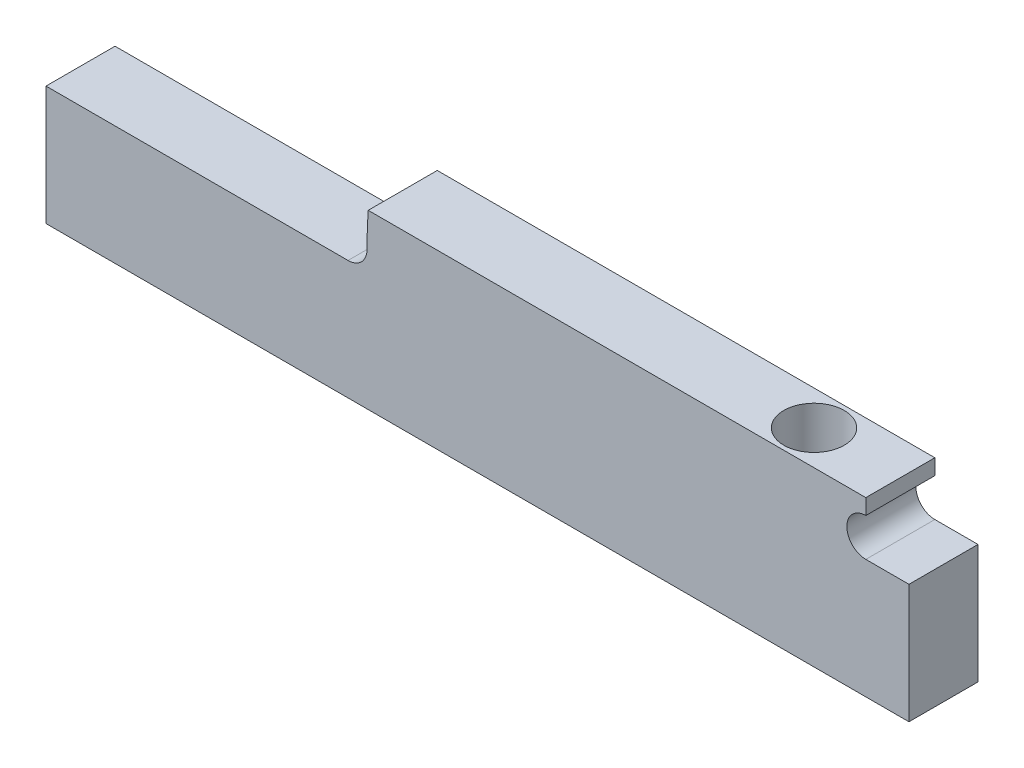
ISO-10303-21;
HEADER;
FILE_DESCRIPTION(('STEP AP214'),'2;1');
FILE_NAME('part.step','',(''),(''),'','','');
FILE_SCHEMA(('AUTOMOTIVE_DESIGN { 1 0 10303 214 1 1 1 1 }'));
ENDSEC;
DATA;
#1=APPLICATION_CONTEXT('core data for automotive mechanical design processes');
#2=APPLICATION_PROTOCOL_DEFINITION('international standard','automotive_design',2000,#1);
#3=PRODUCT_CONTEXT('',#1,'mechanical');
#4=PRODUCT('Part','Part','',(#3));
#5=PRODUCT_RELATED_PRODUCT_CATEGORY('part','',(#4));
#6=PRODUCT_DEFINITION_FORMATION('','',#4);
#7=PRODUCT_DEFINITION_CONTEXT('part definition',#1,'design');
#8=PRODUCT_DEFINITION('design','',#6,#7);
#9=PRODUCT_DEFINITION_SHAPE('','',#8);
#10=(LENGTH_UNIT() NAMED_UNIT(*) SI_UNIT(.MILLI.,.METRE.));
#11=(NAMED_UNIT(*) PLANE_ANGLE_UNIT() SI_UNIT($,.RADIAN.));
#12=(NAMED_UNIT(*) SI_UNIT($,.STERADIAN.) SOLID_ANGLE_UNIT());
#13=UNCERTAINTY_MEASURE_WITH_UNIT(LENGTH_MEASURE(1.E-05),#10,'distance_accuracy_value','');
#14=(GEOMETRIC_REPRESENTATION_CONTEXT(3) GLOBAL_UNCERTAINTY_ASSIGNED_CONTEXT((#13)) GLOBAL_UNIT_ASSIGNED_CONTEXT((#10,
#11,#12)) REPRESENTATION_CONTEXT('',''));
#15=CARTESIAN_POINT('',(0.,0.,0.));
#16=DIRECTION('',(0.,0.,1.));
#17=DIRECTION('',(1.,0.,0.));
#18=AXIS2_PLACEMENT_3D('',#15,#16,#17);
#19=CARTESIAN_POINT('',(-8.91228247245608,4.58727080479658,4.));
#20=DIRECTION('',(0.,1.,0.));
#21=DIRECTION('',(0.,0.,1.));
#22=AXIS2_PLACEMENT_3D('',#19,#20,#21);
#23=CYLINDRICAL_SURFACE('',#22,2.);
#24=CARTESIAN_POINT('',(-8.91228247245608,4.58727080479658,4.));
#25=DIRECTION('',(0.,1.,0.));
#26=DIRECTION('',(0.,0.,1.));
#27=AXIS2_PLACEMENT_3D('',#24,#25,#26);
#28=CIRCLE('',#27,2.);
#29=CARTESIAN_POINT('',(-8.91228247245608,4.58727080479658,6.));
#30=VERTEX_POINT('',#29);
#31=EDGE_CURVE('E147',#30,#30,#28,.T.);
#32=ORIENTED_EDGE('',*,*,#31,.F.);
#33=EDGE_LOOP('',(#32));
#34=FACE_BOUND('',#33,.T.);
#35=CARTESIAN_POINT('',(-8.91228247245608,9.58727080479659,4.));
#36=DIRECTION('',(0.,1.,0.));
#37=DIRECTION('',(0.,0.,1.));
#38=AXIS2_PLACEMENT_3D('',#35,#36,#37);
#39=CIRCLE('',#38,2.);
#40=CARTESIAN_POINT('',(-8.91228247245608,9.58727080479659,6.));
#41=VERTEX_POINT('',#40);
#42=EDGE_CURVE('E37',#41,#41,#39,.F.);
#43=ORIENTED_EDGE('',*,*,#42,.F.);
#44=EDGE_LOOP('',(#43));
#45=FACE_BOUND('',#44,.T.);
#46=ADVANCED_FACE('F33',(#34,#45),#23,.F.);
#47=CARTESIAN_POINT('',(1.08771752754392,20.5872708047966,8.));
#48=DIRECTION('',(0.,0.,-1.));
#49=DIRECTION('',(-1.,0.,0.));
#50=AXIS2_PLACEMENT_3D('',#47,#48,#49);
#51=CYLINDRICAL_SURFACE('',#50,2.2);
#52=CARTESIAN_POINT('',(1.08771752754392,20.5872708047966,0.));
#53=DIRECTION('',(0.,0.,-1.));
#54=DIRECTION('',(1.,0.,0.));
#55=AXIS2_PLACEMENT_3D('',#52,#53,#54);
#56=CIRCLE('',#55,2.2);
#57=CARTESIAN_POINT('',(1.08771752754392,18.3872708047966,0.));
#58=VERTEX_POINT('',#57);
#59=CARTESIAN_POINT('',(1.08771752754392,22.7872708047966,0.));
#60=VERTEX_POINT('',#59);
#61=EDGE_CURVE('E143',#58,#60,#56,.T.);
#62=ORIENTED_EDGE('',*,*,#61,.T.);
#63=DIRECTION('',(0.,0.,-1.));
#64=VECTOR('',#63,1.);
#65=CARTESIAN_POINT('',(1.08771752754392,22.7872708047966,8.));
#66=LINE('',#65,#64);
#67=CARTESIAN_POINT('',(1.08771752754392,22.7872708047966,8.));
#68=VERTEX_POINT('',#67);
#69=EDGE_CURVE('E11',#68,#60,#66,.T.);
#70=ORIENTED_EDGE('',*,*,#69,.F.);
#71=CARTESIAN_POINT('',(1.08771752754392,20.5872708047966,8.));
#72=DIRECTION('',(0.,0.,-1.));
#73=DIRECTION('',(1.,0.,0.));
#74=AXIS2_PLACEMENT_3D('',#71,#72,#73);
#75=CIRCLE('',#74,2.2);
#76=CARTESIAN_POINT('',(1.08771752754392,18.3872708047966,8.));
#77=VERTEX_POINT('',#76);
#78=EDGE_CURVE('E162',#77,#68,#75,.T.);
#79=ORIENTED_EDGE('',*,*,#78,.F.);
#80=DIRECTION('',(0.,0.,-1.));
#81=VECTOR('',#80,1.);
#82=CARTESIAN_POINT('',(1.08771752754392,18.3872708047966,8.));
#83=LINE('',#82,#81);
#84=EDGE_CURVE('E139',#77,#58,#83,.T.);
#85=ORIENTED_EDGE('',*,*,#84,.T.);
#86=EDGE_LOOP('',(#62,#70,#79,#85));
#87=FACE_BOUND('',#86,.T.);
#88=ADVANCED_FACE('F35',(#87),#51,.F.);
#89=CARTESIAN_POINT('',(1.08771752754392,22.7872708047966,8.));
#90=DIRECTION('',(-1.,0.,0.));
#91=DIRECTION('',(0.,-1.,0.));
#92=AXIS2_PLACEMENT_3D('',#89,#90,#91);
#93=PLANE('',#92);
#94=DIRECTION('',(0.,1.,0.));
#95=VECTOR('',#94,1.);
#96=CARTESIAN_POINT('',(1.08771752754392,22.7872708047966,0.));
#97=LINE('',#96,#95);
#98=CARTESIAN_POINT('',(1.08771752754392,24.5872708047966,0.));
#99=VERTEX_POINT('',#98);
#100=EDGE_CURVE('E146',#60,#99,#97,.T.);
#101=ORIENTED_EDGE('',*,*,#100,.T.);
#102=DIRECTION('',(0.,0.,-1.));
#103=VECTOR('',#102,1.);
#104=CARTESIAN_POINT('',(1.08771752754392,24.5872708047966,8.));
#105=LINE('',#104,#103);
#106=CARTESIAN_POINT('',(1.08771752754392,24.5872708047966,8.));
#107=VERTEX_POINT('',#106);
#108=EDGE_CURVE('E43',#107,#99,#105,.T.);
#109=ORIENTED_EDGE('',*,*,#108,.F.);
#110=DIRECTION('',(0.,1.,0.));
#111=VECTOR('',#110,1.);
#112=CARTESIAN_POINT('',(1.08771752754392,22.7872708047966,8.));
#113=LINE('',#112,#111);
#114=EDGE_CURVE('E100',#68,#107,#113,.T.);
#115=ORIENTED_EDGE('',*,*,#114,.F.);
#116=ORIENTED_EDGE('',*,*,#69,.T.);
#117=EDGE_LOOP('',(#101,#109,#115,#116));
#118=FACE_BOUND('',#117,.T.);
#119=ADVANCED_FACE('F232',(#118),#93,.F.);
#120=CARTESIAN_POINT('',(-56.5737080531682,24.5872708047966,8.));
#121=DIRECTION('',(0.,-1.,0.));
#122=DIRECTION('',(0.,0.,-1.));
#123=AXIS2_PLACEMENT_3D('',#120,#121,#122);
#124=PLANE('',#123);
#125=CARTESIAN_POINT('',(-8.91228247245608,24.5872708047966,4.));
#126=DIRECTION('',(0.,1.,0.));
#127=DIRECTION('',(0.,0.,1.));
#128=AXIS2_PLACEMENT_3D('',#125,#126,#127);
#129=CIRCLE('',#128,3.5);
#130=CARTESIAN_POINT('',(-8.91228247245608,24.5872708047966,7.5));
#131=VERTEX_POINT('',#130);
#132=EDGE_CURVE('E212',#131,#131,#129,.T.);
#133=ORIENTED_EDGE('',*,*,#132,.F.);
#134=EDGE_LOOP('',(#133));
#135=FACE_BOUND('',#134,.T.);
#136=DIRECTION('',(-1.,0.,0.));
#137=VECTOR('',#136,1.);
#138=CARTESIAN_POINT('',(-56.5737080531682,24.5872708047966,0.));
#139=LINE('',#138,#137);
#140=CARTESIAN_POINT('',(-56.5737080531682,24.5872708047966,0.));
#141=VERTEX_POINT('',#140);
#142=EDGE_CURVE('E149',#99,#141,#139,.T.);
#143=ORIENTED_EDGE('',*,*,#142,.T.);
#144=DIRECTION('',(0.,0.,-1.));
#145=VECTOR('',#144,1.);
#146=CARTESIAN_POINT('',(-56.5737080531682,24.5872708047966,8.));
#147=LINE('',#146,#145);
#148=CARTESIAN_POINT('',(-56.5737080531682,24.5872708047966,8.));
#149=VERTEX_POINT('',#148);
#150=EDGE_CURVE('E175',#149,#141,#147,.T.);
#151=ORIENTED_EDGE('',*,*,#150,.F.);
#152=DIRECTION('',(-1.,0.,0.));
#153=VECTOR('',#152,1.);
#154=CARTESIAN_POINT('',(-56.5737080531682,24.5872708047966,8.));
#155=LINE('',#154,#153);
#156=EDGE_CURVE('E184',#107,#149,#155,.T.);
#157=ORIENTED_EDGE('',*,*,#156,.F.);
#158=ORIENTED_EDGE('',*,*,#108,.T.);
#159=EDGE_LOOP('',(#143,#151,#157,#158));
#160=FACE_BOUND('',#159,.T.);
#161=ADVANCED_FACE('F182',(#135,#160),#124,.F.);
#162=CARTESIAN_POINT('',(1.08771752754392,20.5872708047966,8.));
#163=DIRECTION('',(0.,0.,-1.));
#164=DIRECTION('',(-1.,0.,0.));
#165=AXIS2_PLACEMENT_3D('',#162,#163,#164);
#166=CYLINDRICAL_SURFACE('',#165,57.8);
#167=CARTESIAN_POINT('',(1.08771752754392,20.5872708047966,0.));
#168=DIRECTION('',(0.,0.,1.));
#169=DIRECTION('',(1.,0.,0.));
#170=AXIS2_PLACEMENT_3D('',#167,#168,#169);
#171=CIRCLE('',#170,57.8);
#172=CARTESIAN_POINT('',(-56.7122824724561,20.5872708047966,0.));
#173=VERTEX_POINT('',#172);
#174=EDGE_CURVE('E151',#141,#173,#171,.T.);
#175=ORIENTED_EDGE('',*,*,#174,.T.);
#176=DIRECTION('',(0.,0.,-1.));
#177=VECTOR('',#176,1.);
#178=CARTESIAN_POINT('',(-56.7122824724561,20.5872708047966,8.));
#179=LINE('',#178,#177);
#180=CARTESIAN_POINT('',(-56.7122824724561,20.5872708047966,8.));
#181=VERTEX_POINT('',#180);
#182=EDGE_CURVE('E172',#181,#173,#179,.T.);
#183=ORIENTED_EDGE('',*,*,#182,.F.);
#184=CARTESIAN_POINT('',(1.08771752754392,20.5872708047966,8.));
#185=DIRECTION('',(0.,0.,1.));
#186=DIRECTION('',(1.,0.,0.));
#187=AXIS2_PLACEMENT_3D('',#184,#185,#186);
#188=CIRCLE('',#187,57.8);
#189=EDGE_CURVE('E202',#149,#181,#188,.T.);
#190=ORIENTED_EDGE('',*,*,#189,.F.);
#191=ORIENTED_EDGE('',*,*,#150,.T.);
#192=EDGE_LOOP('',(#175,#183,#190,#191));
#193=FACE_BOUND('',#192,.T.);
#194=ADVANCED_FACE('F193',(#193),#166,.T.);
#195=CARTESIAN_POINT('',(-58.9122824724561,20.5872708047966,8.));
#196=DIRECTION('',(0.,0.,-1.));
#197=DIRECTION('',(-1.,0.,0.));
#198=AXIS2_PLACEMENT_3D('',#195,#196,#197);
#199=CYLINDRICAL_SURFACE('',#198,2.2);
#200=CARTESIAN_POINT('',(-58.9122824724561,20.5872708047966,0.));
#201=DIRECTION('',(0.,0.,-1.));
#202=DIRECTION('',(1.,0.,0.));
#203=AXIS2_PLACEMENT_3D('',#200,#201,#202);
#204=CIRCLE('',#203,2.2);
#205=CARTESIAN_POINT('',(-58.9122824724561,18.3872708047966,0.));
#206=VERTEX_POINT('',#205);
#207=EDGE_CURVE('E153',#173,#206,#204,.T.);
#208=ORIENTED_EDGE('',*,*,#207,.T.);
#209=DIRECTION('',(0.,0.,-1.));
#210=VECTOR('',#209,1.);
#211=CARTESIAN_POINT('',(-58.9122824724561,18.3872708047966,8.));
#212=LINE('',#211,#210);
#213=CARTESIAN_POINT('',(-58.9122824724561,18.3872708047966,8.));
#214=VERTEX_POINT('',#213);
#215=EDGE_CURVE('E169',#214,#206,#212,.T.);
#216=ORIENTED_EDGE('',*,*,#215,.F.);
#217=CARTESIAN_POINT('',(-58.9122824724561,20.5872708047966,8.));
#218=DIRECTION('',(0.,0.,-1.));
#219=DIRECTION('',(1.,0.,0.));
#220=AXIS2_PLACEMENT_3D('',#217,#218,#219);
#221=CIRCLE('',#220,2.2);
#222=EDGE_CURVE('E199',#181,#214,#221,.T.);
#223=ORIENTED_EDGE('',*,*,#222,.F.);
#224=ORIENTED_EDGE('',*,*,#182,.T.);
#225=EDGE_LOOP('',(#208,#216,#223,#224));
#226=FACE_BOUND('',#225,.T.);
#227=ADVANCED_FACE('F197',(#226),#199,.F.);
#228=CARTESIAN_POINT('',(-58.9122824724561,18.3872708047966,8.));
#229=DIRECTION('',(0.,-1.,0.));
#230=DIRECTION('',(0.,0.,-1.));
#231=AXIS2_PLACEMENT_3D('',#228,#229,#230);
#232=PLANE('',#231);
#233=DIRECTION('',(-1.,0.,0.));
#234=VECTOR('',#233,1.);
#235=CARTESIAN_POINT('',(-58.9122824724561,18.3872708047966,0.));
#236=LINE('',#235,#234);
#237=CARTESIAN_POINT('',(-93.9122824724561,18.3872708047966,0.));
#238=VERTEX_POINT('',#237);
#239=EDGE_CURVE('E155',#206,#238,#236,.T.);
#240=ORIENTED_EDGE('',*,*,#239,.T.);
#241=DIRECTION('',(0.,0.,-1.));
#242=VECTOR('',#241,1.);
#243=CARTESIAN_POINT('',(-93.9122824724561,18.3872708047966,8.));
#244=LINE('',#243,#242);
#245=CARTESIAN_POINT('',(-93.9122824724561,18.3872708047966,8.));
#246=VERTEX_POINT('',#245);
#247=EDGE_CURVE('E166',#246,#238,#244,.T.);
#248=ORIENTED_EDGE('',*,*,#247,.F.);
#249=DIRECTION('',(-1.,0.,0.));
#250=VECTOR('',#249,1.);
#251=CARTESIAN_POINT('',(-58.9122824724561,18.3872708047966,8.));
#252=LINE('',#251,#250);
#253=EDGE_CURVE('E201',#214,#246,#252,.T.);
#254=ORIENTED_EDGE('',*,*,#253,.F.);
#255=ORIENTED_EDGE('',*,*,#215,.T.);
#256=EDGE_LOOP('',(#240,#248,#254,#255));
#257=FACE_BOUND('',#256,.T.);
#258=ADVANCED_FACE('F253',(#257),#232,.F.);
#259=CARTESIAN_POINT('',(-93.9122824724561,4.58727080479658,8.));
#260=DIRECTION('',(1.,0.,0.));
#261=DIRECTION('',(0.,0.,-1.));
#262=AXIS2_PLACEMENT_3D('',#259,#260,#261);
#263=PLANE('',#262);
#264=DIRECTION('',(0.,-1.,0.));
#265=VECTOR('',#264,1.);
#266=CARTESIAN_POINT('',(-93.9122824724561,4.58727080479658,0.));
#267=LINE('',#266,#265);
#268=CARTESIAN_POINT('',(-93.9122824724561,4.58727080479658,0.));
#269=VERTEX_POINT('',#268);
#270=EDGE_CURVE('E157',#238,#269,#267,.T.);
#271=ORIENTED_EDGE('',*,*,#270,.T.);
#272=DIRECTION('',(0.,0.,-1.));
#273=VECTOR('',#272,1.);
#274=CARTESIAN_POINT('',(-93.9122824724561,4.58727080479658,8.));
#275=LINE('',#274,#273);
#276=CARTESIAN_POINT('',(-93.9122824724561,4.58727080479658,8.));
#277=VERTEX_POINT('',#276);
#278=EDGE_CURVE('E134',#277,#269,#275,.T.);
#279=ORIENTED_EDGE('',*,*,#278,.F.);
#280=DIRECTION('',(0.,-1.,0.));
#281=VECTOR('',#280,1.);
#282=CARTESIAN_POINT('',(-93.9122824724561,4.58727080479658,8.));
#283=LINE('',#282,#281);
#284=EDGE_CURVE('E125',#246,#277,#283,.T.);
#285=ORIENTED_EDGE('',*,*,#284,.F.);
#286=ORIENTED_EDGE('',*,*,#247,.T.);
#287=EDGE_LOOP('',(#271,#279,#285,#286));
#288=FACE_BOUND('',#287,.T.);
#289=ADVANCED_FACE('F249',(#288),#263,.F.);
#290=CARTESIAN_POINT('',(6.08771752754392,4.58727080479658,8.));
#291=DIRECTION('',(0.,1.,0.));
#292=DIRECTION('',(0.,0.,1.));
#293=AXIS2_PLACEMENT_3D('',#290,#291,#292);
#294=PLANE('',#293);
#295=ORIENTED_EDGE('',*,*,#31,.T.);
#296=EDGE_LOOP('',(#295));
#297=FACE_BOUND('',#296,.T.);
#298=DIRECTION('',(1.,0.,0.));
#299=VECTOR('',#298,1.);
#300=CARTESIAN_POINT('',(6.08771752754392,4.58727080479658,0.));
#301=LINE('',#300,#299);
#302=CARTESIAN_POINT('',(6.08771752754392,4.58727080479658,0.));
#303=VERTEX_POINT('',#302);
#304=EDGE_CURVE('E133',#269,#303,#301,.T.);
#305=ORIENTED_EDGE('',*,*,#304,.T.);
#306=DIRECTION('',(0.,0.,-1.));
#307=VECTOR('',#306,1.);
#308=CARTESIAN_POINT('',(6.08771752754392,4.58727080479658,8.));
#309=LINE('',#308,#307);
#310=CARTESIAN_POINT('',(6.08771752754392,4.58727080479658,8.));
#311=VERTEX_POINT('',#310);
#312=EDGE_CURVE('E130',#311,#303,#309,.T.);
#313=ORIENTED_EDGE('',*,*,#312,.F.);
#314=DIRECTION('',(1.,0.,0.));
#315=VECTOR('',#314,1.);
#316=CARTESIAN_POINT('',(6.08771752754392,4.58727080479658,8.));
#317=LINE('',#316,#315);
#318=EDGE_CURVE('E119',#277,#311,#317,.T.);
#319=ORIENTED_EDGE('',*,*,#318,.F.);
#320=ORIENTED_EDGE('',*,*,#278,.T.);
#321=EDGE_LOOP('',(#305,#313,#319,#320));
#322=FACE_BOUND('',#321,.T.);
#323=ADVANCED_FACE('F131',(#297,#322),#294,.F.);
#324=CARTESIAN_POINT('',(6.08771752754392,18.3872708047966,8.));
#325=DIRECTION('',(-1.,0.,0.));
#326=DIRECTION('',(0.,-1.,0.));
#327=AXIS2_PLACEMENT_3D('',#324,#325,#326);
#328=PLANE('',#327);
#329=DIRECTION('',(0.,1.,0.));
#330=VECTOR('',#329,1.);
#331=CARTESIAN_POINT('',(6.08771752754392,18.3872708047966,0.));
#332=LINE('',#331,#330);
#333=CARTESIAN_POINT('',(6.08771752754392,18.3872708047966,0.));
#334=VERTEX_POINT('',#333);
#335=EDGE_CURVE('E86',#303,#334,#332,.T.);
#336=ORIENTED_EDGE('',*,*,#335,.T.);
#337=DIRECTION('',(0.,0.,-1.));
#338=VECTOR('',#337,1.);
#339=CARTESIAN_POINT('',(6.08771752754392,18.3872708047966,8.));
#340=LINE('',#339,#338);
#341=CARTESIAN_POINT('',(6.08771752754392,18.3872708047966,8.));
#342=VERTEX_POINT('',#341);
#343=EDGE_CURVE('E135',#342,#334,#340,.T.);
#344=ORIENTED_EDGE('',*,*,#343,.F.);
#345=DIRECTION('',(0.,1.,0.));
#346=VECTOR('',#345,1.);
#347=CARTESIAN_POINT('',(6.08771752754392,18.3872708047966,8.));
#348=LINE('',#347,#346);
#349=EDGE_CURVE('E123',#311,#342,#348,.T.);
#350=ORIENTED_EDGE('',*,*,#349,.F.);
#351=ORIENTED_EDGE('',*,*,#312,.T.);
#352=EDGE_LOOP('',(#336,#344,#350,#351));
#353=FACE_BOUND('',#352,.T.);
#354=ADVANCED_FACE('F137',(#353),#328,.F.);
#355=CARTESIAN_POINT('',(1.08771752754392,18.3872708047966,8.));
#356=DIRECTION('',(0.,-1.,0.));
#357=DIRECTION('',(1.,0.,0.));
#358=AXIS2_PLACEMENT_3D('',#355,#356,#357);
#359=PLANE('',#358);
#360=DIRECTION('',(-1.,0.,0.));
#361=VECTOR('',#360,1.);
#362=CARTESIAN_POINT('',(1.08771752754392,18.3872708047966,0.));
#363=LINE('',#362,#361);
#364=EDGE_CURVE('E92',#334,#58,#363,.T.);
#365=ORIENTED_EDGE('',*,*,#364,.T.);
#366=ORIENTED_EDGE('',*,*,#84,.F.);
#367=DIRECTION('',(-1.,0.,0.));
#368=VECTOR('',#367,1.);
#369=CARTESIAN_POINT('',(1.08771752754392,18.3872708047966,8.));
#370=LINE('',#369,#368);
#371=EDGE_CURVE('E51',#342,#77,#370,.T.);
#372=ORIENTED_EDGE('',*,*,#371,.F.);
#373=ORIENTED_EDGE('',*,*,#343,.T.);
#374=EDGE_LOOP('',(#365,#366,#372,#373));
#375=FACE_BOUND('',#374,.T.);
#376=ADVANCED_FACE('F241',(#375),#359,.F.);
#377=CARTESIAN_POINT('',(1.08771752754392,20.5872708047966,8.));
#378=DIRECTION('',(0.,0.,1.));
#379=DIRECTION('',(1.,0.,0.));
#380=AXIS2_PLACEMENT_3D('',#377,#378,#379);
#381=PLANE('',#380);
#382=ORIENTED_EDGE('',*,*,#78,.T.);
#383=ORIENTED_EDGE('',*,*,#114,.T.);
#384=ORIENTED_EDGE('',*,*,#156,.T.);
#385=ORIENTED_EDGE('',*,*,#189,.T.);
#386=ORIENTED_EDGE('',*,*,#222,.T.);
#387=ORIENTED_EDGE('',*,*,#253,.T.);
#388=ORIENTED_EDGE('',*,*,#284,.T.);
#389=ORIENTED_EDGE('',*,*,#318,.T.);
#390=ORIENTED_EDGE('',*,*,#349,.T.);
#391=ORIENTED_EDGE('',*,*,#371,.T.);
#392=EDGE_LOOP('',(#382,#383,#384,#385,#386,#387,#388,#389,#390,#391));
#393=FACE_BOUND('',#392,.T.);
#394=ADVANCED_FACE('F121',(#393),#381,.T.);
#395=CARTESIAN_POINT('',(1.08771752754392,20.5872708047966,0.));
#396=DIRECTION('',(0.,0.,1.));
#397=DIRECTION('',(1.,0.,0.));
#398=AXIS2_PLACEMENT_3D('',#395,#396,#397);
#399=PLANE('',#398);
#400=ORIENTED_EDGE('',*,*,#61,.F.);
#401=ORIENTED_EDGE('',*,*,#364,.F.);
#402=ORIENTED_EDGE('',*,*,#335,.F.);
#403=ORIENTED_EDGE('',*,*,#304,.F.);
#404=ORIENTED_EDGE('',*,*,#270,.F.);
#405=ORIENTED_EDGE('',*,*,#239,.F.);
#406=ORIENTED_EDGE('',*,*,#207,.F.);
#407=ORIENTED_EDGE('',*,*,#174,.F.);
#408=ORIENTED_EDGE('',*,*,#142,.F.);
#409=ORIENTED_EDGE('',*,*,#100,.F.);
#410=EDGE_LOOP('',(#400,#401,#402,#403,#404,#405,#406,#407,#408,#409));
#411=FACE_BOUND('',#410,.T.);
#412=ADVANCED_FACE('F188',(#411),#399,.F.);
#413=CARTESIAN_POINT('',(-8.91228247245608,9.58727080479659,4.));
#414=DIRECTION('',(0.,1.,0.));
#415=DIRECTION('',(0.,0.,1.));
#416=AXIS2_PLACEMENT_3D('',#413,#414,#415);
#417=PLANE('',#416);
#418=CARTESIAN_POINT('',(-8.91228247245608,9.58727080479659,4.));
#419=DIRECTION('',(0.,1.,0.));
#420=DIRECTION('',(0.,0.,1.));
#421=AXIS2_PLACEMENT_3D('',#418,#419,#420);
#422=CIRCLE('',#421,3.5);
#423=CARTESIAN_POINT('',(-8.91228247245608,9.58727080479659,7.5));
#424=VERTEX_POINT('',#423);
#425=EDGE_CURVE('E215',#424,#424,#422,.T.);
#426=ORIENTED_EDGE('',*,*,#425,.T.);
#427=EDGE_LOOP('',(#426));
#428=FACE_BOUND('',#427,.T.);
#429=ORIENTED_EDGE('',*,*,#42,.T.);
#430=EDGE_LOOP('',(#429));
#431=FACE_BOUND('',#430,.T.);
#432=ADVANCED_FACE('F222',(#428,#431),#417,.T.);
#433=CARTESIAN_POINT('',(-8.91228247245608,9.58727080479659,4.));
#434=DIRECTION('',(0.,1.,0.));
#435=DIRECTION('',(0.,0.,1.));
#436=AXIS2_PLACEMENT_3D('',#433,#434,#435);
#437=CYLINDRICAL_SURFACE('',#436,3.5);
#438=ORIENTED_EDGE('',*,*,#425,.F.);
#439=EDGE_LOOP('',(#438));
#440=FACE_BOUND('',#439,.T.);
#441=ORIENTED_EDGE('',*,*,#132,.T.);
#442=EDGE_LOOP('',(#441));
#443=FACE_BOUND('',#442,.T.);
#444=ADVANCED_FACE('F237',(#440,#443),#437,.F.);
#445=CLOSED_SHELL('',(#46,#88,#119,#161,#194,#227,#258,#289,#323,#354,#376,#394,#412,#432,#444));
#446=MANIFOLD_SOLID_BREP('B2',#445);
#447=ADVANCED_BREP_SHAPE_REPRESENTATION('',(#18,#446),#14);
#448=SHAPE_DEFINITION_REPRESENTATION(#9,#447);
ENDSEC;
END-ISO-10303-21;
